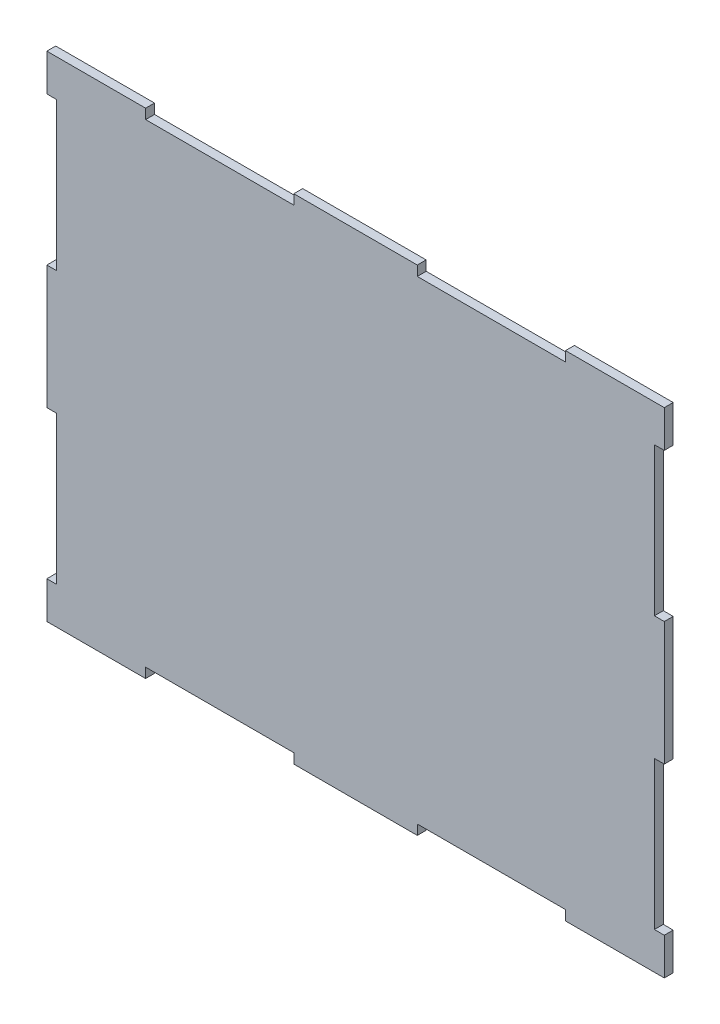
ISO-10303-21;
HEADER;
FILE_DESCRIPTION(('STEP AP214'),'2;1');
FILE_NAME('part.step','',(''),(''),'','','');
FILE_SCHEMA(('AUTOMOTIVE_DESIGN { 1 0 10303 214 1 1 1 1 }'));
ENDSEC;
DATA;
#1=APPLICATION_CONTEXT('core data for automotive mechanical design processes');
#2=APPLICATION_PROTOCOL_DEFINITION('international standard','automotive_design',2000,#1);
#3=PRODUCT_CONTEXT('',#1,'mechanical');
#4=PRODUCT('Part','Part','',(#3));
#5=PRODUCT_RELATED_PRODUCT_CATEGORY('part','',(#4));
#6=PRODUCT_DEFINITION_FORMATION('','',#4);
#7=PRODUCT_DEFINITION_CONTEXT('part definition',#1,'design');
#8=PRODUCT_DEFINITION('design','',#6,#7);
#9=PRODUCT_DEFINITION_SHAPE('','',#8);
#10=(LENGTH_UNIT() NAMED_UNIT(*) SI_UNIT(.MILLI.,.METRE.));
#11=(NAMED_UNIT(*) PLANE_ANGLE_UNIT() SI_UNIT($,.RADIAN.));
#12=(NAMED_UNIT(*) SI_UNIT($,.STERADIAN.) SOLID_ANGLE_UNIT());
#13=UNCERTAINTY_MEASURE_WITH_UNIT(LENGTH_MEASURE(1.E-05),#10,'distance_accuracy_value','');
#14=(GEOMETRIC_REPRESENTATION_CONTEXT(3) GLOBAL_UNCERTAINTY_ASSIGNED_CONTEXT((#13)) GLOBAL_UNIT_ASSIGNED_CONTEXT((#10,
#11,#12)) REPRESENTATION_CONTEXT('',''));
#15=CARTESIAN_POINT('',(0.,0.,0.));
#16=DIRECTION('',(0.,0.,1.));
#17=DIRECTION('',(1.,0.,0.));
#18=AXIS2_PLACEMENT_3D('',#15,#16,#17);
#19=CARTESIAN_POINT('',(-125.,-100.,3.6));
#20=DIRECTION('',(0.,1.,0.));
#21=DIRECTION('',(0.,0.,1.));
#22=AXIS2_PLACEMENT_3D('',#19,#20,#21);
#23=PLANE('',#22);
#24=DIRECTION('',(1.,0.,0.));
#25=VECTOR('',#24,1.);
#26=CARTESIAN_POINT('',(-125.,-100.,0.));
#27=LINE('',#26,#25);
#28=CARTESIAN_POINT('',(-25.,-100.,0.));
#29=VERTEX_POINT('',#28);
#30=CARTESIAN_POINT('',(25.,-100.,0.));
#31=VERTEX_POINT('',#30);
#32=EDGE_CURVE('E443',#29,#31,#27,.T.);
#33=ORIENTED_EDGE('',*,*,#32,.T.);
#34=DIRECTION('',(0.,0.,1.));
#35=VECTOR('',#34,1.);
#36=CARTESIAN_POINT('',(25.,-100.,-6.4));
#37=LINE('',#36,#35);
#38=CARTESIAN_POINT('',(25.,-100.,3.6));
#39=VERTEX_POINT('',#38);
#40=EDGE_CURVE('E284',#31,#39,#37,.T.);
#41=ORIENTED_EDGE('',*,*,#40,.T.);
#42=DIRECTION('',(1.,0.,0.));
#43=VECTOR('',#42,1.);
#44=CARTESIAN_POINT('',(-125.,-100.,3.6));
#45=LINE('',#44,#43);
#46=CARTESIAN_POINT('',(-25.,-100.,3.6));
#47=VERTEX_POINT('',#46);
#48=EDGE_CURVE('E423',#47,#39,#45,.T.);
#49=ORIENTED_EDGE('',*,*,#48,.F.);
#50=DIRECTION('',(0.,0.,1.));
#51=VECTOR('',#50,1.);
#52=CARTESIAN_POINT('',(-25.,-100.,-6.4));
#53=LINE('',#52,#51);
#54=EDGE_CURVE('E280',#29,#47,#53,.T.);
#55=ORIENTED_EDGE('',*,*,#54,.F.);
#56=EDGE_LOOP('',(#33,#41,#49,#55));
#57=FACE_BOUND('',#56,.T.);
#58=ADVANCED_FACE('F33',(#57),#23,.F.);
#59=CARTESIAN_POINT('',(85.,-100.,3.6));
#60=VERTEX_POINT('',#59);
#61=CARTESIAN_POINT('',(125.,-100.,3.6));
#62=VERTEX_POINT('',#61);
#63=EDGE_CURVE('E417',#60,#62,#45,.T.);
#64=ORIENTED_EDGE('',*,*,#63,.F.);
#65=DIRECTION('',(0.,0.,1.));
#66=VECTOR('',#65,1.);
#67=CARTESIAN_POINT('',(85.,-100.,-6.4));
#68=LINE('',#67,#66);
#69=CARTESIAN_POINT('',(85.,-100.,0.));
#70=VERTEX_POINT('',#69);
#71=EDGE_CURVE('E306',#70,#60,#68,.T.);
#72=ORIENTED_EDGE('',*,*,#71,.F.);
#73=CARTESIAN_POINT('',(125.,-100.,0.));
#74=VERTEX_POINT('',#73);
#75=EDGE_CURVE('E437',#70,#74,#27,.T.);
#76=ORIENTED_EDGE('',*,*,#75,.T.);
#77=DIRECTION('',(0.,0.,-1.));
#78=VECTOR('',#77,1.);
#79=CARTESIAN_POINT('',(125.,-100.,3.6));
#80=LINE('',#79,#78);
#81=EDGE_CURVE('E458',#62,#74,#80,.T.);
#82=ORIENTED_EDGE('',*,*,#81,.F.);
#83=EDGE_LOOP('',(#64,#72,#76,#82));
#84=FACE_BOUND('',#83,.T.);
#85=ADVANCED_FACE('F599',(#84),#23,.F.);
#86=CARTESIAN_POINT('',(-125.,100.,3.6));
#87=DIRECTION('',(0.,-1.,0.));
#88=DIRECTION('',(0.,0.,-1.));
#89=AXIS2_PLACEMENT_3D('',#86,#87,#88);
#90=PLANE('',#89);
#91=DIRECTION('',(-1.,0.,0.));
#92=VECTOR('',#91,1.);
#93=CARTESIAN_POINT('',(-125.,100.,3.6));
#94=LINE('',#93,#92);
#95=CARTESIAN_POINT('',(-85.,100.,3.6));
#96=VERTEX_POINT('',#95);
#97=CARTESIAN_POINT('',(-125.,100.,3.6));
#98=VERTEX_POINT('',#97);
#99=EDGE_CURVE('E427',#96,#98,#94,.T.);
#100=ORIENTED_EDGE('',*,*,#99,.F.);
#101=DIRECTION('',(0.,0.,1.));
#102=VECTOR('',#101,1.);
#103=CARTESIAN_POINT('',(-85.,100.,-6.4));
#104=LINE('',#103,#102);
#105=CARTESIAN_POINT('',(-85.,100.,0.));
#106=VERTEX_POINT('',#105);
#107=EDGE_CURVE('E323',#106,#96,#104,.T.);
#108=ORIENTED_EDGE('',*,*,#107,.F.);
#109=DIRECTION('',(-1.,0.,0.));
#110=VECTOR('',#109,1.);
#111=CARTESIAN_POINT('',(-125.,100.,0.));
#112=LINE('',#111,#110);
#113=CARTESIAN_POINT('',(-125.,100.,0.));
#114=VERTEX_POINT('',#113);
#115=EDGE_CURVE('E447',#106,#114,#112,.T.);
#116=ORIENTED_EDGE('',*,*,#115,.T.);
#117=DIRECTION('',(0.,0.,-1.));
#118=VECTOR('',#117,1.);
#119=CARTESIAN_POINT('',(-125.,100.,3.6));
#120=LINE('',#119,#118);
#121=EDGE_CURVE('E432',#98,#114,#120,.T.);
#122=ORIENTED_EDGE('',*,*,#121,.F.);
#123=EDGE_LOOP('',(#100,#108,#116,#122));
#124=FACE_BOUND('',#123,.T.);
#125=ADVANCED_FACE('F552',(#124),#90,.F.);
#126=CARTESIAN_POINT('',(25.,100.,0.));
#127=VERTEX_POINT('',#126);
#128=CARTESIAN_POINT('',(-25.,100.,0.));
#129=VERTEX_POINT('',#128);
#130=EDGE_CURVE('E452',#127,#129,#112,.T.);
#131=ORIENTED_EDGE('',*,*,#130,.T.);
#132=DIRECTION('',(0.,0.,1.));
#133=VECTOR('',#132,1.);
#134=CARTESIAN_POINT('',(-25.,100.,-6.4));
#135=LINE('',#134,#133);
#136=CARTESIAN_POINT('',(-25.,100.,3.6));
#137=VERTEX_POINT('',#136);
#138=EDGE_CURVE('E325',#129,#137,#135,.T.);
#139=ORIENTED_EDGE('',*,*,#138,.T.);
#140=CARTESIAN_POINT('',(25.,100.,3.6));
#141=VERTEX_POINT('',#140);
#142=EDGE_CURVE('E433',#141,#137,#94,.T.);
#143=ORIENTED_EDGE('',*,*,#142,.F.);
#144=DIRECTION('',(0.,0.,1.));
#145=VECTOR('',#144,1.);
#146=CARTESIAN_POINT('',(25.,100.,-6.4));
#147=LINE('',#146,#145);
#148=EDGE_CURVE('E340',#127,#141,#147,.T.);
#149=ORIENTED_EDGE('',*,*,#148,.F.);
#150=EDGE_LOOP('',(#131,#139,#143,#149));
#151=FACE_BOUND('',#150,.T.);
#152=ADVANCED_FACE('F548',(#151),#90,.F.);
#153=CARTESIAN_POINT('',(-125.,100.,3.6));
#154=DIRECTION('',(1.,0.,0.));
#155=DIRECTION('',(0.,1.,0.));
#156=AXIS2_PLACEMENT_3D('',#153,#154,#155);
#157=PLANE('',#156);
#158=DIRECTION('',(0.,-1.,0.));
#159=VECTOR('',#158,1.);
#160=CARTESIAN_POINT('',(-125.,100.,0.));
#161=LINE('',#160,#159);
#162=CARTESIAN_POINT('',(-125.,85.,0.));
#163=VERTEX_POINT('',#162);
#164=EDGE_CURVE('E434',#114,#163,#161,.T.);
#165=ORIENTED_EDGE('',*,*,#164,.T.);
#166=DIRECTION('',(0.,0.,1.));
#167=VECTOR('',#166,1.);
#168=CARTESIAN_POINT('',(-125.,85.,-6.4));
#169=LINE('',#168,#167);
#170=CARTESIAN_POINT('',(-125.,85.,3.6));
#171=VERTEX_POINT('',#170);
#172=EDGE_CURVE('E367',#163,#171,#169,.T.);
#173=ORIENTED_EDGE('',*,*,#172,.T.);
#174=DIRECTION('',(0.,-1.,0.));
#175=VECTOR('',#174,1.);
#176=CARTESIAN_POINT('',(-125.,100.,3.6));
#177=LINE('',#176,#175);
#178=EDGE_CURVE('E414',#98,#171,#177,.T.);
#179=ORIENTED_EDGE('',*,*,#178,.F.);
#180=ORIENTED_EDGE('',*,*,#121,.T.);
#181=EDGE_LOOP('',(#165,#173,#179,#180));
#182=FACE_BOUND('',#181,.T.);
#183=ADVANCED_FACE('F556',(#182),#157,.F.);
#184=CARTESIAN_POINT('',(-125.,-85.,3.6));
#185=VERTEX_POINT('',#184);
#186=CARTESIAN_POINT('',(-125.,-100.,3.6));
#187=VERTEX_POINT('',#186);
#188=EDGE_CURVE('E419',#185,#187,#177,.T.);
#189=ORIENTED_EDGE('',*,*,#188,.F.);
#190=DIRECTION('',(0.,0.,1.));
#191=VECTOR('',#190,1.);
#192=CARTESIAN_POINT('',(-125.,-85.,-6.4));
#193=LINE('',#192,#191);
#194=CARTESIAN_POINT('',(-125.,-85.,0.));
#195=VERTEX_POINT('',#194);
#196=EDGE_CURVE('E357',#195,#185,#193,.T.);
#197=ORIENTED_EDGE('',*,*,#196,.F.);
#198=CARTESIAN_POINT('',(-125.,-100.,0.));
#199=VERTEX_POINT('',#198);
#200=EDGE_CURVE('E408',#195,#199,#161,.T.);
#201=ORIENTED_EDGE('',*,*,#200,.T.);
#202=DIRECTION('',(0.,0.,-1.));
#203=VECTOR('',#202,1.);
#204=CARTESIAN_POINT('',(-125.,-100.,3.6));
#205=LINE('',#204,#203);
#206=EDGE_CURVE('E461',#187,#199,#205,.T.);
#207=ORIENTED_EDGE('',*,*,#206,.F.);
#208=EDGE_LOOP('',(#189,#197,#201,#207));
#209=FACE_BOUND('',#208,.T.);
#210=ADVANCED_FACE('F583',(#209),#157,.F.);
#211=CARTESIAN_POINT('',(125.,100.,3.6));
#212=DIRECTION('',(-1.,0.,0.));
#213=DIRECTION('',(0.,-1.,0.));
#214=AXIS2_PLACEMENT_3D('',#211,#212,#213);
#215=PLANE('',#214);
#216=DIRECTION('',(0.,1.,0.));
#217=VECTOR('',#216,1.);
#218=CARTESIAN_POINT('',(125.,100.,0.));
#219=LINE('',#218,#217);
#220=CARTESIAN_POINT('',(125.,-85.,0.));
#221=VERTEX_POINT('',#220);
#222=EDGE_CURVE('E444',#74,#221,#219,.T.);
#223=ORIENTED_EDGE('',*,*,#222,.T.);
#224=DIRECTION('',(0.,0.,1.));
#225=VECTOR('',#224,1.);
#226=CARTESIAN_POINT('',(125.,-85.,-6.4));
#227=LINE('',#226,#225);
#228=CARTESIAN_POINT('',(125.,-85.,3.6));
#229=VERTEX_POINT('',#228);
#230=EDGE_CURVE('E373',#221,#229,#227,.T.);
#231=ORIENTED_EDGE('',*,*,#230,.T.);
#232=DIRECTION('',(0.,1.,0.));
#233=VECTOR('',#232,1.);
#234=CARTESIAN_POINT('',(125.,100.,3.6));
#235=LINE('',#234,#233);
#236=EDGE_CURVE('E424',#62,#229,#235,.T.);
#237=ORIENTED_EDGE('',*,*,#236,.F.);
#238=ORIENTED_EDGE('',*,*,#81,.T.);
#239=EDGE_LOOP('',(#223,#231,#237,#238));
#240=FACE_BOUND('',#239,.T.);
#241=ADVANCED_FACE('F615',(#240),#215,.F.);
#242=CARTESIAN_POINT('',(125.,-25.,3.6));
#243=VERTEX_POINT('',#242);
#244=CARTESIAN_POINT('',(125.,25.,3.6));
#245=VERTEX_POINT('',#244);
#246=EDGE_CURVE('E428',#243,#245,#235,.T.);
#247=ORIENTED_EDGE('',*,*,#246,.F.);
#248=DIRECTION('',(0.,0.,1.));
#249=VECTOR('',#248,1.);
#250=CARTESIAN_POINT('',(125.,-25.,-6.4));
#251=LINE('',#250,#249);
#252=CARTESIAN_POINT('',(125.,-25.,0.));
#253=VERTEX_POINT('',#252);
#254=EDGE_CURVE('E372',#253,#243,#251,.T.);
#255=ORIENTED_EDGE('',*,*,#254,.F.);
#256=CARTESIAN_POINT('',(125.,25.,0.));
#257=VERTEX_POINT('',#256);
#258=EDGE_CURVE('E448',#253,#257,#219,.T.);
#259=ORIENTED_EDGE('',*,*,#258,.T.);
#260=DIRECTION('',(0.,0.,1.));
#261=VECTOR('',#260,1.);
#262=CARTESIAN_POINT('',(125.,25.,-6.4));
#263=LINE('',#262,#261);
#264=EDGE_CURVE('E405',#257,#245,#263,.T.);
#265=ORIENTED_EDGE('',*,*,#264,.T.);
#266=EDGE_LOOP('',(#247,#255,#259,#265));
#267=FACE_BOUND('',#266,.T.);
#268=ADVANCED_FACE('F616',(#267),#215,.F.);
#269=CARTESIAN_POINT('',(-125.,25.,3.6));
#270=VERTEX_POINT('',#269);
#271=CARTESIAN_POINT('',(-125.,-25.,3.6));
#272=VERTEX_POINT('',#271);
#273=EDGE_CURVE('E418',#270,#272,#177,.T.);
#274=ORIENTED_EDGE('',*,*,#273,.F.);
#275=DIRECTION('',(0.,0.,1.));
#276=VECTOR('',#275,1.);
#277=CARTESIAN_POINT('',(-125.,25.,-6.4));
#278=LINE('',#277,#276);
#279=CARTESIAN_POINT('',(-125.,25.,0.));
#280=VERTEX_POINT('',#279);
#281=EDGE_CURVE('E389',#280,#270,#278,.T.);
#282=ORIENTED_EDGE('',*,*,#281,.F.);
#283=CARTESIAN_POINT('',(-125.,-25.,0.));
#284=VERTEX_POINT('',#283);
#285=EDGE_CURVE('E438',#280,#284,#161,.T.);
#286=ORIENTED_EDGE('',*,*,#285,.T.);
#287=DIRECTION('',(0.,0.,1.));
#288=VECTOR('',#287,1.);
#289=CARTESIAN_POINT('',(-125.,-25.,-6.4));
#290=LINE('',#289,#288);
#291=EDGE_CURVE('E359',#284,#272,#290,.T.);
#292=ORIENTED_EDGE('',*,*,#291,.T.);
#293=EDGE_LOOP('',(#274,#282,#286,#292));
#294=FACE_BOUND('',#293,.T.);
#295=ADVANCED_FACE('F35',(#294),#157,.F.);
#296=CARTESIAN_POINT('',(-85.,-100.,0.));
#297=VERTEX_POINT('',#296);
#298=EDGE_CURVE('E439',#199,#297,#27,.T.);
#299=ORIENTED_EDGE('',*,*,#298,.T.);
#300=DIRECTION('',(0.,0.,1.));
#301=VECTOR('',#300,1.);
#302=CARTESIAN_POINT('',(-85.,-100.,-6.4));
#303=LINE('',#302,#301);
#304=CARTESIAN_POINT('',(-85.,-100.,3.6));
#305=VERTEX_POINT('',#304);
#306=EDGE_CURVE('E294',#297,#305,#303,.T.);
#307=ORIENTED_EDGE('',*,*,#306,.T.);
#308=EDGE_CURVE('E420',#187,#305,#45,.T.);
#309=ORIENTED_EDGE('',*,*,#308,.F.);
#310=ORIENTED_EDGE('',*,*,#206,.T.);
#311=EDGE_LOOP('',(#299,#307,#309,#310));
#312=FACE_BOUND('',#311,.T.);
#313=ADVANCED_FACE('F582',(#312),#23,.F.);
#314=CARTESIAN_POINT('',(125.,85.,3.6));
#315=VERTEX_POINT('',#314);
#316=CARTESIAN_POINT('',(125.,100.,3.6));
#317=VERTEX_POINT('',#316);
#318=EDGE_CURVE('E422',#315,#317,#235,.T.);
#319=ORIENTED_EDGE('',*,*,#318,.F.);
#320=DIRECTION('',(0.,0.,1.));
#321=VECTOR('',#320,1.);
#322=CARTESIAN_POINT('',(125.,85.,-6.4));
#323=LINE('',#322,#321);
#324=CARTESIAN_POINT('',(125.,85.,0.));
#325=VERTEX_POINT('',#324);
#326=EDGE_CURVE('E404',#325,#315,#323,.T.);
#327=ORIENTED_EDGE('',*,*,#326,.F.);
#328=CARTESIAN_POINT('',(125.,100.,0.));
#329=VERTEX_POINT('',#328);
#330=EDGE_CURVE('E442',#325,#329,#219,.T.);
#331=ORIENTED_EDGE('',*,*,#330,.T.);
#332=DIRECTION('',(0.,0.,-1.));
#333=VECTOR('',#332,1.);
#334=CARTESIAN_POINT('',(125.,100.,3.6));
#335=LINE('',#334,#333);
#336=EDGE_CURVE('E455',#317,#329,#335,.T.);
#337=ORIENTED_EDGE('',*,*,#336,.F.);
#338=EDGE_LOOP('',(#319,#327,#331,#337));
#339=FACE_BOUND('',#338,.T.);
#340=ADVANCED_FACE('F608',(#339),#215,.F.);
#341=CARTESIAN_POINT('',(85.,100.,0.));
#342=VERTEX_POINT('',#341);
#343=EDGE_CURVE('E449',#329,#342,#112,.T.);
#344=ORIENTED_EDGE('',*,*,#343,.T.);
#345=DIRECTION('',(0.,0.,1.));
#346=VECTOR('',#345,1.);
#347=CARTESIAN_POINT('',(85.,100.,-6.4));
#348=LINE('',#347,#346);
#349=CARTESIAN_POINT('',(85.,100.,3.6));
#350=VERTEX_POINT('',#349);
#351=EDGE_CURVE('E342',#342,#350,#348,.T.);
#352=ORIENTED_EDGE('',*,*,#351,.T.);
#353=EDGE_CURVE('E429',#317,#350,#94,.T.);
#354=ORIENTED_EDGE('',*,*,#353,.F.);
#355=ORIENTED_EDGE('',*,*,#336,.T.);
#356=EDGE_LOOP('',(#344,#352,#354,#355));
#357=FACE_BOUND('',#356,.T.);
#358=ADVANCED_FACE('F613',(#357),#90,.F.);
#359=CARTESIAN_POINT('',(0.,0.,3.6));
#360=DIRECTION('',(0.,0.,1.));
#361=DIRECTION('',(1.,0.,0.));
#362=AXIS2_PLACEMENT_3D('',#359,#360,#361);
#363=PLANE('',#362);
#364=DIRECTION('',(0.,-1.,0.));
#365=VECTOR('',#364,1.);
#366=CARTESIAN_POINT('',(-85.,96.,3.6));
#367=LINE('',#366,#365);
#368=CARTESIAN_POINT('',(-85.,96.,3.6));
#369=VERTEX_POINT('',#368);
#370=EDGE_CURVE('E318',#96,#369,#367,.T.);
#371=ORIENTED_EDGE('',*,*,#370,.F.);
#372=ORIENTED_EDGE('',*,*,#99,.T.);
#373=ORIENTED_EDGE('',*,*,#178,.T.);
#374=DIRECTION('',(-1.,0.,0.));
#375=VECTOR('',#374,1.);
#376=CARTESIAN_POINT('',(-125.,85.,3.6));
#377=LINE('',#376,#375);
#378=CARTESIAN_POINT('',(-121.,85.,3.6));
#379=VERTEX_POINT('',#378);
#380=EDGE_CURVE('E387',#379,#171,#377,.T.);
#381=ORIENTED_EDGE('',*,*,#380,.F.);
#382=DIRECTION('',(0.,1.,0.));
#383=VECTOR('',#382,1.);
#384=CARTESIAN_POINT('',(-121.,85.,3.6));
#385=LINE('',#384,#383);
#386=CARTESIAN_POINT('',(-121.,25.,3.6));
#387=VERTEX_POINT('',#386);
#388=EDGE_CURVE('E384',#387,#379,#385,.T.);
#389=ORIENTED_EDGE('',*,*,#388,.F.);
#390=DIRECTION('',(1.,0.,0.));
#391=VECTOR('',#390,1.);
#392=CARTESIAN_POINT('',(-125.,25.,3.6));
#393=LINE('',#392,#391);
#394=EDGE_CURVE('E356',#270,#387,#393,.T.);
#395=ORIENTED_EDGE('',*,*,#394,.F.);
#396=ORIENTED_EDGE('',*,*,#273,.T.);
#397=DIRECTION('',(-1.,0.,0.));
#398=VECTOR('',#397,1.);
#399=CARTESIAN_POINT('',(-125.,-25.,3.6));
#400=LINE('',#399,#398);
#401=CARTESIAN_POINT('',(-121.,-25.,3.6));
#402=VERTEX_POINT('',#401);
#403=EDGE_CURVE('E348',#402,#272,#400,.T.);
#404=ORIENTED_EDGE('',*,*,#403,.F.);
#405=DIRECTION('',(0.,1.,0.));
#406=VECTOR('',#405,1.);
#407=CARTESIAN_POINT('',(-121.,-25.,3.6));
#408=LINE('',#407,#406);
#409=CARTESIAN_POINT('',(-121.,-85.,3.6));
#410=VERTEX_POINT('',#409);
#411=EDGE_CURVE('E339',#410,#402,#408,.T.);
#412=ORIENTED_EDGE('',*,*,#411,.F.);
#413=DIRECTION('',(1.,0.,0.));
#414=VECTOR('',#413,1.);
#415=CARTESIAN_POINT('',(-125.,-85.,3.6));
#416=LINE('',#415,#414);
#417=EDGE_CURVE('E350',#185,#410,#416,.T.);
#418=ORIENTED_EDGE('',*,*,#417,.F.);
#419=ORIENTED_EDGE('',*,*,#188,.T.);
#420=ORIENTED_EDGE('',*,*,#308,.T.);
#421=DIRECTION('',(0.,-1.,0.));
#422=VECTOR('',#421,1.);
#423=CARTESIAN_POINT('',(-85.,-96.,3.6));
#424=LINE('',#423,#422);
#425=CARTESIAN_POINT('',(-85.,-96.,3.6));
#426=VERTEX_POINT('',#425);
#427=EDGE_CURVE('E274',#426,#305,#424,.T.);
#428=ORIENTED_EDGE('',*,*,#427,.F.);
#429=DIRECTION('',(-1.,0.,0.));
#430=VECTOR('',#429,1.);
#431=CARTESIAN_POINT('',(-85.,-96.,3.6));
#432=LINE('',#431,#430);
#433=CARTESIAN_POINT('',(-25.,-96.,3.6));
#434=VERTEX_POINT('',#433);
#435=EDGE_CURVE('E268',#434,#426,#432,.T.);
#436=ORIENTED_EDGE('',*,*,#435,.F.);
#437=DIRECTION('',(0.,1.,0.));
#438=VECTOR('',#437,1.);
#439=CARTESIAN_POINT('',(-25.,-96.,3.6));
#440=LINE('',#439,#438);
#441=EDGE_CURVE('E277',#47,#434,#440,.T.);
#442=ORIENTED_EDGE('',*,*,#441,.F.);
#443=ORIENTED_EDGE('',*,*,#48,.T.);
#444=DIRECTION('',(0.,-1.,0.));
#445=VECTOR('',#444,1.);
#446=CARTESIAN_POINT('',(25.,-96.,3.6));
#447=LINE('',#446,#445);
#448=CARTESIAN_POINT('',(25.,-96.,3.6));
#449=VERTEX_POINT('',#448);
#450=EDGE_CURVE('E304',#449,#39,#447,.T.);
#451=ORIENTED_EDGE('',*,*,#450,.F.);
#452=DIRECTION('',(-1.,0.,0.));
#453=VECTOR('',#452,1.);
#454=CARTESIAN_POINT('',(25.,-96.,3.6));
#455=LINE('',#454,#453);
#456=CARTESIAN_POINT('',(85.,-96.,3.6));
#457=VERTEX_POINT('',#456);
#458=EDGE_CURVE('E300',#457,#449,#455,.T.);
#459=ORIENTED_EDGE('',*,*,#458,.F.);
#460=DIRECTION('',(0.,1.,0.));
#461=VECTOR('',#460,1.);
#462=CARTESIAN_POINT('',(85.,-96.,3.6));
#463=LINE('',#462,#461);
#464=EDGE_CURVE('E298',#60,#457,#463,.T.);
#465=ORIENTED_EDGE('',*,*,#464,.F.);
#466=ORIENTED_EDGE('',*,*,#63,.T.);
#467=ORIENTED_EDGE('',*,*,#236,.T.);
#468=DIRECTION('',(1.,0.,0.));
#469=VECTOR('',#468,1.);
#470=CARTESIAN_POINT('',(125.,-85.,3.6));
#471=LINE('',#470,#469);
#472=CARTESIAN_POINT('',(121.,-85.,3.6));
#473=VERTEX_POINT('',#472);
#474=EDGE_CURVE('E370',#473,#229,#471,.T.);
#475=ORIENTED_EDGE('',*,*,#474,.F.);
#476=DIRECTION('',(0.,-1.,0.));
#477=VECTOR('',#476,1.);
#478=CARTESIAN_POINT('',(121.,-25.,3.6));
#479=LINE('',#478,#477);
#480=CARTESIAN_POINT('',(121.,-25.,3.6));
#481=VERTEX_POINT('',#480);
#482=EDGE_CURVE('E366',#481,#473,#479,.T.);
#483=ORIENTED_EDGE('',*,*,#482,.F.);
#484=DIRECTION('',(-1.,0.,0.));
#485=VECTOR('',#484,1.);
#486=CARTESIAN_POINT('',(125.,-25.,3.6));
#487=LINE('',#486,#485);
#488=EDGE_CURVE('E363',#243,#481,#487,.T.);
#489=ORIENTED_EDGE('',*,*,#488,.F.);
#490=ORIENTED_EDGE('',*,*,#246,.T.);
#491=DIRECTION('',(1.,0.,0.));
#492=VECTOR('',#491,1.);
#493=CARTESIAN_POINT('',(125.,25.,3.6));
#494=LINE('',#493,#492);
#495=CARTESIAN_POINT('',(121.,25.,3.6));
#496=VERTEX_POINT('',#495);
#497=EDGE_CURVE('E402',#496,#245,#494,.T.);
#498=ORIENTED_EDGE('',*,*,#497,.F.);
#499=DIRECTION('',(0.,-1.,0.));
#500=VECTOR('',#499,1.);
#501=CARTESIAN_POINT('',(121.,85.,3.6));
#502=LINE('',#501,#500);
#503=CARTESIAN_POINT('',(121.,85.,3.6));
#504=VERTEX_POINT('',#503);
#505=EDGE_CURVE('E399',#504,#496,#502,.T.);
#506=ORIENTED_EDGE('',*,*,#505,.F.);
#507=DIRECTION('',(-1.,0.,0.));
#508=VECTOR('',#507,1.);
#509=CARTESIAN_POINT('',(125.,85.,3.6));
#510=LINE('',#509,#508);
#511=EDGE_CURVE('E376',#315,#504,#510,.T.);
#512=ORIENTED_EDGE('',*,*,#511,.F.);
#513=ORIENTED_EDGE('',*,*,#318,.T.);
#514=ORIENTED_EDGE('',*,*,#353,.T.);
#515=DIRECTION('',(0.,1.,0.));
#516=VECTOR('',#515,1.);
#517=CARTESIAN_POINT('',(85.,96.,3.6));
#518=LINE('',#517,#516);
#519=CARTESIAN_POINT('',(85.,96.,3.6));
#520=VERTEX_POINT('',#519);
#521=EDGE_CURVE('E331',#520,#350,#518,.T.);
#522=ORIENTED_EDGE('',*,*,#521,.F.);
#523=DIRECTION('',(1.,0.,0.));
#524=VECTOR('',#523,1.);
#525=CARTESIAN_POINT('',(25.,96.,3.6));
#526=LINE('',#525,#524);
#527=CARTESIAN_POINT('',(25.,96.,3.6));
#528=VERTEX_POINT('',#527);
#529=EDGE_CURVE('E293',#528,#520,#526,.T.);
#530=ORIENTED_EDGE('',*,*,#529,.F.);
#531=DIRECTION('',(0.,-1.,0.));
#532=VECTOR('',#531,1.);
#533=CARTESIAN_POINT('',(25.,96.,3.6));
#534=LINE('',#533,#532);
#535=EDGE_CURVE('E333',#141,#528,#534,.T.);
#536=ORIENTED_EDGE('',*,*,#535,.F.);
#537=ORIENTED_EDGE('',*,*,#142,.T.);
#538=DIRECTION('',(0.,1.,0.));
#539=VECTOR('',#538,1.);
#540=CARTESIAN_POINT('',(-25.,96.,3.6));
#541=LINE('',#540,#539);
#542=CARTESIAN_POINT('',(-25.,96.,3.6));
#543=VERTEX_POINT('',#542);
#544=EDGE_CURVE('E316',#543,#137,#541,.T.);
#545=ORIENTED_EDGE('',*,*,#544,.F.);
#546=DIRECTION('',(1.,0.,0.));
#547=VECTOR('',#546,1.);
#548=CARTESIAN_POINT('',(-85.,96.,3.6));
#549=LINE('',#548,#547);
#550=EDGE_CURVE('E313',#369,#543,#549,.T.);
#551=ORIENTED_EDGE('',*,*,#550,.F.);
#552=EDGE_LOOP('',(#371,#372,#373,#381,#389,#395,#396,#404,#412,#418,#419,#420,#428,#436,#442,
#443,#451,#459,#465,#466,#467,#475,#483,#489,#490,#498,#506,#512,#513,#514,#522,#530,#536,#537,
#545,#551));
#553=FACE_BOUND('',#552,.T.);
#554=ADVANCED_FACE('F287',(#553),#363,.T.);
#555=CARTESIAN_POINT('',(0.,0.,0.));
#556=DIRECTION('',(0.,0.,1.));
#557=DIRECTION('',(1.,0.,0.));
#558=AXIS2_PLACEMENT_3D('',#555,#556,#557);
#559=PLANE('',#558);
#560=ORIENTED_EDGE('',*,*,#115,.F.);
#561=DIRECTION('',(0.,-1.,0.));
#562=VECTOR('',#561,1.);
#563=CARTESIAN_POINT('',(-85.,0.,0.));
#564=LINE('',#563,#562);
#565=CARTESIAN_POINT('',(-85.,96.,0.));
#566=VERTEX_POINT('',#565);
#567=EDGE_CURVE('E11',#106,#566,#564,.T.);
#568=ORIENTED_EDGE('',*,*,#567,.T.);
#569=DIRECTION('',(1.,0.,0.));
#570=VECTOR('',#569,1.);
#571=CARTESIAN_POINT('',(0.,96.,0.));
#572=LINE('',#571,#570);
#573=CARTESIAN_POINT('',(-25.,96.,0.));
#574=VERTEX_POINT('',#573);
#575=EDGE_CURVE('E41',#566,#574,#572,.T.);
#576=ORIENTED_EDGE('',*,*,#575,.T.);
#577=DIRECTION('',(0.,1.,0.));
#578=VECTOR('',#577,1.);
#579=CARTESIAN_POINT('',(-25.,0.,0.));
#580=LINE('',#579,#578);
#581=EDGE_CURVE('E524',#574,#129,#580,.T.);
#582=ORIENTED_EDGE('',*,*,#581,.T.);
#583=ORIENTED_EDGE('',*,*,#130,.F.);
#584=DIRECTION('',(0.,-1.,0.));
#585=VECTOR('',#584,1.);
#586=CARTESIAN_POINT('',(25.0000000000001,0.,0.));
#587=LINE('',#586,#585);
#588=CARTESIAN_POINT('',(25.,96.,0.));
#589=VERTEX_POINT('',#588);
#590=EDGE_CURVE('E506',#127,#589,#587,.T.);
#591=ORIENTED_EDGE('',*,*,#590,.T.);
#592=DIRECTION('',(1.,0.,0.));
#593=VECTOR('',#592,1.);
#594=CARTESIAN_POINT('',(0.,96.,0.));
#595=LINE('',#594,#593);
#596=CARTESIAN_POINT('',(85.,96.,0.));
#597=VERTEX_POINT('',#596);
#598=EDGE_CURVE('E503',#589,#597,#595,.T.);
#599=ORIENTED_EDGE('',*,*,#598,.T.);
#600=DIRECTION('',(0.,1.,0.));
#601=VECTOR('',#600,1.);
#602=CARTESIAN_POINT('',(85.,0.,0.));
#603=LINE('',#602,#601);
#604=EDGE_CURVE('E500',#597,#342,#603,.T.);
#605=ORIENTED_EDGE('',*,*,#604,.T.);
#606=ORIENTED_EDGE('',*,*,#343,.F.);
#607=ORIENTED_EDGE('',*,*,#330,.F.);
#608=DIRECTION('',(-1.,0.,0.));
#609=VECTOR('',#608,1.);
#610=CARTESIAN_POINT('',(5.89805981832128E-13,85.0000000000009,0.));
#611=LINE('',#610,#609);
#612=CARTESIAN_POINT('',(121.,85.,0.));
#613=VERTEX_POINT('',#612);
#614=EDGE_CURVE('E464',#325,#613,#611,.T.);
#615=ORIENTED_EDGE('',*,*,#614,.T.);
#616=DIRECTION('',(0.,-1.,0.));
#617=VECTOR('',#616,1.);
#618=CARTESIAN_POINT('',(121.,0.,0.));
#619=LINE('',#618,#617);
#620=CARTESIAN_POINT('',(121.,25.,0.));
#621=VERTEX_POINT('',#620);
#622=EDGE_CURVE('E467',#613,#621,#619,.T.);
#623=ORIENTED_EDGE('',*,*,#622,.T.);
#624=DIRECTION('',(1.,0.,0.));
#625=VECTOR('',#624,1.);
#626=CARTESIAN_POINT('',(1.951563910474E-13,25.000000000001,0.));
#627=LINE('',#626,#625);
#628=EDGE_CURVE('E470',#621,#257,#627,.T.);
#629=ORIENTED_EDGE('',*,*,#628,.T.);
#630=ORIENTED_EDGE('',*,*,#258,.F.);
#631=DIRECTION('',(-1.,0.,0.));
#632=VECTOR('',#631,1.);
#633=CARTESIAN_POINT('',(-1.95156391047386E-13,-24.999999999999,0.));
#634=LINE('',#633,#632);
#635=CARTESIAN_POINT('',(121.,-25.,0.));
#636=VERTEX_POINT('',#635);
#637=EDGE_CURVE('E491',#253,#636,#634,.T.);
#638=ORIENTED_EDGE('',*,*,#637,.T.);
#639=DIRECTION('',(0.,-1.,0.));
#640=VECTOR('',#639,1.);
#641=CARTESIAN_POINT('',(121.,0.,0.));
#642=LINE('',#641,#640);
#643=CARTESIAN_POINT('',(121.,-85.,0.));
#644=VERTEX_POINT('',#643);
#645=EDGE_CURVE('E494',#636,#644,#642,.T.);
#646=ORIENTED_EDGE('',*,*,#645,.T.);
#647=DIRECTION('',(1.,0.,0.));
#648=VECTOR('',#647,1.);
#649=CARTESIAN_POINT('',(-5.89805981832116E-13,-84.9999999999991,0.));
#650=LINE('',#649,#648);
#651=EDGE_CURVE('E497',#644,#221,#650,.T.);
#652=ORIENTED_EDGE('',*,*,#651,.T.);
#653=ORIENTED_EDGE('',*,*,#222,.F.);
#654=ORIENTED_EDGE('',*,*,#75,.F.);
#655=DIRECTION('',(0.,1.,0.));
#656=VECTOR('',#655,1.);
#657=CARTESIAN_POINT('',(85.,0.,0.));
#658=LINE('',#657,#656);
#659=CARTESIAN_POINT('',(85.,-96.,0.));
#660=VERTEX_POINT('',#659);
#661=EDGE_CURVE('E515',#70,#660,#658,.T.);
#662=ORIENTED_EDGE('',*,*,#661,.T.);
#663=DIRECTION('',(-1.,0.,0.));
#664=VECTOR('',#663,1.);
#665=CARTESIAN_POINT('',(0.,-96.,0.));
#666=LINE('',#665,#664);
#667=CARTESIAN_POINT('',(25.,-96.,0.));
#668=VERTEX_POINT('',#667);
#669=EDGE_CURVE('E518',#660,#668,#666,.T.);
#670=ORIENTED_EDGE('',*,*,#669,.T.);
#671=DIRECTION('',(0.,-1.,0.));
#672=VECTOR('',#671,1.);
#673=CARTESIAN_POINT('',(25.0000000000001,0.,0.));
#674=LINE('',#673,#672);
#675=EDGE_CURVE('E521',#668,#31,#674,.T.);
#676=ORIENTED_EDGE('',*,*,#675,.T.);
#677=ORIENTED_EDGE('',*,*,#32,.F.);
#678=DIRECTION('',(0.,1.,0.));
#679=VECTOR('',#678,1.);
#680=CARTESIAN_POINT('',(-25.,0.,0.));
#681=LINE('',#680,#679);
#682=CARTESIAN_POINT('',(-25.,-96.,0.));
#683=VERTEX_POINT('',#682);
#684=EDGE_CURVE('E513',#29,#683,#681,.T.);
#685=ORIENTED_EDGE('',*,*,#684,.T.);
#686=DIRECTION('',(-1.,0.,0.));
#687=VECTOR('',#686,1.);
#688=CARTESIAN_POINT('',(0.,-96.,0.));
#689=LINE('',#688,#687);
#690=CARTESIAN_POINT('',(-85.,-96.,0.));
#691=VERTEX_POINT('',#690);
#692=EDGE_CURVE('E271',#683,#691,#689,.T.);
#693=ORIENTED_EDGE('',*,*,#692,.T.);
#694=DIRECTION('',(0.,-1.,0.));
#695=VECTOR('',#694,1.);
#696=CARTESIAN_POINT('',(-85.,0.,0.));
#697=LINE('',#696,#695);
#698=EDGE_CURVE('E510',#691,#297,#697,.T.);
#699=ORIENTED_EDGE('',*,*,#698,.T.);
#700=ORIENTED_EDGE('',*,*,#298,.F.);
#701=ORIENTED_EDGE('',*,*,#200,.F.);
#702=DIRECTION('',(1.,0.,0.));
#703=VECTOR('',#702,1.);
#704=CARTESIAN_POINT('',(0.,-85.,0.));
#705=LINE('',#704,#703);
#706=CARTESIAN_POINT('',(-121.,-85.,0.));
#707=VERTEX_POINT('',#706);
#708=EDGE_CURVE('E479',#195,#707,#705,.T.);
#709=ORIENTED_EDGE('',*,*,#708,.T.);
#710=DIRECTION('',(0.,1.,0.));
#711=VECTOR('',#710,1.);
#712=CARTESIAN_POINT('',(-121.,0.,0.));
#713=LINE('',#712,#711);
#714=CARTESIAN_POINT('',(-121.,-25.,0.));
#715=VERTEX_POINT('',#714);
#716=EDGE_CURVE('E476',#707,#715,#713,.T.);
#717=ORIENTED_EDGE('',*,*,#716,.T.);
#718=DIRECTION('',(-1.,0.,0.));
#719=VECTOR('',#718,1.);
#720=CARTESIAN_POINT('',(0.,-25.,0.));
#721=LINE('',#720,#719);
#722=EDGE_CURVE('E473',#715,#284,#721,.T.);
#723=ORIENTED_EDGE('',*,*,#722,.T.);
#724=ORIENTED_EDGE('',*,*,#285,.F.);
#725=DIRECTION('',(1.,0.,0.));
#726=VECTOR('',#725,1.);
#727=CARTESIAN_POINT('',(0.,25.,0.));
#728=LINE('',#727,#726);
#729=CARTESIAN_POINT('',(-121.,25.,0.));
#730=VERTEX_POINT('',#729);
#731=EDGE_CURVE('E482',#280,#730,#728,.T.);
#732=ORIENTED_EDGE('',*,*,#731,.T.);
#733=DIRECTION('',(0.,1.,0.));
#734=VECTOR('',#733,1.);
#735=CARTESIAN_POINT('',(-121.,0.,0.));
#736=LINE('',#735,#734);
#737=CARTESIAN_POINT('',(-121.,85.,0.));
#738=VERTEX_POINT('',#737);
#739=EDGE_CURVE('E485',#730,#738,#736,.T.);
#740=ORIENTED_EDGE('',*,*,#739,.T.);
#741=DIRECTION('',(-1.,0.,0.));
#742=VECTOR('',#741,1.);
#743=CARTESIAN_POINT('',(0.,85.,0.));
#744=LINE('',#743,#742);
#745=EDGE_CURVE('E488',#738,#163,#744,.T.);
#746=ORIENTED_EDGE('',*,*,#745,.T.);
#747=ORIENTED_EDGE('',*,*,#164,.F.);
#748=EDGE_LOOP('',(#560,#568,#576,#582,#583,#591,#599,#605,#606,#607,#615,#623,#629,#630,#638,
#646,#652,#653,#654,#662,#670,#676,#677,#685,#693,#699,#700,#701,#709,#717,#723,#724,#732,#740,
#746,#747));
#749=FACE_BOUND('',#748,.T.);
#750=ADVANCED_FACE('F529',(#749),#559,.F.);
#751=CARTESIAN_POINT('',(125.,25.,-6.4));
#752=DIRECTION('',(0.,-1.,0.));
#753=DIRECTION('',(1.,0.,0.));
#754=AXIS2_PLACEMENT_3D('',#751,#752,#753);
#755=PLANE('',#754);
#756=DIRECTION('',(0.,0.,1.));
#757=VECTOR('',#756,1.);
#758=CARTESIAN_POINT('',(121.,25.,-6.4));
#759=LINE('',#758,#757);
#760=EDGE_CURVE('E409',#621,#496,#759,.T.);
#761=ORIENTED_EDGE('',*,*,#760,.T.);
#762=ORIENTED_EDGE('',*,*,#497,.T.);
#763=ORIENTED_EDGE('',*,*,#264,.F.);
#764=ORIENTED_EDGE('',*,*,#628,.F.);
#765=EDGE_LOOP('',(#761,#762,#763,#764));
#766=FACE_BOUND('',#765,.T.);
#767=ADVANCED_FACE('F635',(#766),#755,.F.);
#768=CARTESIAN_POINT('',(121.,85.,-6.4));
#769=DIRECTION('',(-1.,0.,0.));
#770=DIRECTION('',(0.,0.,1.));
#771=AXIS2_PLACEMENT_3D('',#768,#769,#770);
#772=PLANE('',#771);
#773=DIRECTION('',(0.,0.,1.));
#774=VECTOR('',#773,1.);
#775=CARTESIAN_POINT('',(121.,85.,-6.4));
#776=LINE('',#775,#774);
#777=EDGE_CURVE('E411',#613,#504,#776,.T.);
#778=ORIENTED_EDGE('',*,*,#777,.T.);
#779=ORIENTED_EDGE('',*,*,#505,.T.);
#780=ORIENTED_EDGE('',*,*,#760,.F.);
#781=ORIENTED_EDGE('',*,*,#622,.F.);
#782=EDGE_LOOP('',(#778,#779,#780,#781));
#783=FACE_BOUND('',#782,.T.);
#784=ADVANCED_FACE('F642',(#783),#772,.F.);
#785=CARTESIAN_POINT('',(125.,85.,-6.4));
#786=DIRECTION('',(0.,1.,0.));
#787=DIRECTION('',(-1.,0.,0.));
#788=AXIS2_PLACEMENT_3D('',#785,#786,#787);
#789=PLANE('',#788);
#790=ORIENTED_EDGE('',*,*,#326,.T.);
#791=ORIENTED_EDGE('',*,*,#511,.T.);
#792=ORIENTED_EDGE('',*,*,#777,.F.);
#793=ORIENTED_EDGE('',*,*,#614,.F.);
#794=EDGE_LOOP('',(#790,#791,#792,#793));
#795=FACE_BOUND('',#794,.T.);
#796=ADVANCED_FACE('F638',(#795),#789,.F.);
#797=CARTESIAN_POINT('',(-121.,-25.,-6.4));
#798=DIRECTION('',(1.,0.,0.));
#799=DIRECTION('',(0.,1.,0.));
#800=AXIS2_PLACEMENT_3D('',#797,#798,#799);
#801=PLANE('',#800);
#802=DIRECTION('',(0.,0.,1.));
#803=VECTOR('',#802,1.);
#804=CARTESIAN_POINT('',(-121.,-85.,-6.4));
#805=LINE('',#804,#803);
#806=EDGE_CURVE('E354',#707,#410,#805,.T.);
#807=ORIENTED_EDGE('',*,*,#806,.T.);
#808=ORIENTED_EDGE('',*,*,#411,.T.);
#809=DIRECTION('',(0.,0.,1.));
#810=VECTOR('',#809,1.);
#811=CARTESIAN_POINT('',(-121.,-25.,-6.4));
#812=LINE('',#811,#810);
#813=EDGE_CURVE('E353',#715,#402,#812,.T.);
#814=ORIENTED_EDGE('',*,*,#813,.F.);
#815=ORIENTED_EDGE('',*,*,#716,.F.);
#816=EDGE_LOOP('',(#807,#808,#814,#815));
#817=FACE_BOUND('',#816,.T.);
#818=ADVANCED_FACE('F641',(#817),#801,.F.);
#819=CARTESIAN_POINT('',(-125.,-85.,-6.4));
#820=DIRECTION('',(0.,-1.,0.));
#821=DIRECTION('',(0.,0.,-1.));
#822=AXIS2_PLACEMENT_3D('',#819,#820,#821);
#823=PLANE('',#822);
#824=ORIENTED_EDGE('',*,*,#196,.T.);
#825=ORIENTED_EDGE('',*,*,#417,.T.);
#826=ORIENTED_EDGE('',*,*,#806,.F.);
#827=ORIENTED_EDGE('',*,*,#708,.F.);
#828=EDGE_LOOP('',(#824,#825,#826,#827));
#829=FACE_BOUND('',#828,.T.);
#830=ADVANCED_FACE('F673',(#829),#823,.F.);
#831=CARTESIAN_POINT('',(-125.,-25.,-6.4));
#832=DIRECTION('',(0.,1.,0.));
#833=DIRECTION('',(0.,0.,1.));
#834=AXIS2_PLACEMENT_3D('',#831,#832,#833);
#835=PLANE('',#834);
#836=ORIENTED_EDGE('',*,*,#813,.T.);
#837=ORIENTED_EDGE('',*,*,#403,.T.);
#838=ORIENTED_EDGE('',*,*,#291,.F.);
#839=ORIENTED_EDGE('',*,*,#722,.F.);
#840=EDGE_LOOP('',(#836,#837,#838,#839));
#841=FACE_BOUND('',#840,.T.);
#842=ADVANCED_FACE('F658',(#841),#835,.F.);
#843=CARTESIAN_POINT('',(-125.,85.,-6.4));
#844=DIRECTION('',(0.,1.,0.));
#845=DIRECTION('',(0.,0.,1.));
#846=AXIS2_PLACEMENT_3D('',#843,#844,#845);
#847=PLANE('',#846);
#848=DIRECTION('',(0.,0.,1.));
#849=VECTOR('',#848,1.);
#850=CARTESIAN_POINT('',(-121.,85.,-6.4));
#851=LINE('',#850,#849);
#852=EDGE_CURVE('E392',#738,#379,#851,.T.);
#853=ORIENTED_EDGE('',*,*,#852,.T.);
#854=ORIENTED_EDGE('',*,*,#380,.T.);
#855=ORIENTED_EDGE('',*,*,#172,.F.);
#856=ORIENTED_EDGE('',*,*,#745,.F.);
#857=EDGE_LOOP('',(#853,#854,#855,#856));
#858=FACE_BOUND('',#857,.T.);
#859=ADVANCED_FACE('F560',(#858),#847,.F.);
#860=CARTESIAN_POINT('',(-121.,85.,-6.4));
#861=DIRECTION('',(1.,0.,0.));
#862=DIRECTION('',(0.,0.,-1.));
#863=AXIS2_PLACEMENT_3D('',#860,#861,#862);
#864=PLANE('',#863);
#865=DIRECTION('',(0.,0.,1.));
#866=VECTOR('',#865,1.);
#867=CARTESIAN_POINT('',(-121.,25.,-6.4));
#868=LINE('',#867,#866);
#869=EDGE_CURVE('E394',#730,#387,#868,.T.);
#870=ORIENTED_EDGE('',*,*,#869,.T.);
#871=ORIENTED_EDGE('',*,*,#388,.T.);
#872=ORIENTED_EDGE('',*,*,#852,.F.);
#873=ORIENTED_EDGE('',*,*,#739,.F.);
#874=EDGE_LOOP('',(#870,#871,#872,#873));
#875=FACE_BOUND('',#874,.T.);
#876=ADVANCED_FACE('F562',(#875),#864,.F.);
#877=CARTESIAN_POINT('',(-125.,25.,-6.4));
#878=DIRECTION('',(0.,-1.,0.));
#879=DIRECTION('',(0.,0.,-1.));
#880=AXIS2_PLACEMENT_3D('',#877,#878,#879);
#881=PLANE('',#880);
#882=ORIENTED_EDGE('',*,*,#281,.T.);
#883=ORIENTED_EDGE('',*,*,#394,.T.);
#884=ORIENTED_EDGE('',*,*,#869,.F.);
#885=ORIENTED_EDGE('',*,*,#731,.F.);
#886=EDGE_LOOP('',(#882,#883,#884,#885));
#887=FACE_BOUND('',#886,.T.);
#888=ADVANCED_FACE('F650',(#887),#881,.F.);
#889=CARTESIAN_POINT('',(125.,-85.,-6.4));
#890=DIRECTION('',(0.,-1.,0.));
#891=DIRECTION('',(1.,0.,0.));
#892=AXIS2_PLACEMENT_3D('',#889,#890,#891);
#893=PLANE('',#892);
#894=DIRECTION('',(0.,0.,1.));
#895=VECTOR('',#894,1.);
#896=CARTESIAN_POINT('',(121.,-85.,-6.4));
#897=LINE('',#896,#895);
#898=EDGE_CURVE('E377',#644,#473,#897,.T.);
#899=ORIENTED_EDGE('',*,*,#898,.T.);
#900=ORIENTED_EDGE('',*,*,#474,.T.);
#901=ORIENTED_EDGE('',*,*,#230,.F.);
#902=ORIENTED_EDGE('',*,*,#651,.F.);
#903=EDGE_LOOP('',(#899,#900,#901,#902));
#904=FACE_BOUND('',#903,.T.);
#905=ADVANCED_FACE('F653',(#904),#893,.F.);
#906=CARTESIAN_POINT('',(121.,-25.,-6.4));
#907=DIRECTION('',(-1.,0.,0.));
#908=DIRECTION('',(0.,-1.,0.));
#909=AXIS2_PLACEMENT_3D('',#906,#907,#908);
#910=PLANE('',#909);
#911=DIRECTION('',(0.,0.,1.));
#912=VECTOR('',#911,1.);
#913=CARTESIAN_POINT('',(121.,-25.,-6.4));
#914=LINE('',#913,#912);
#915=EDGE_CURVE('E379',#636,#481,#914,.T.);
#916=ORIENTED_EDGE('',*,*,#915,.T.);
#917=ORIENTED_EDGE('',*,*,#482,.T.);
#918=ORIENTED_EDGE('',*,*,#898,.F.);
#919=ORIENTED_EDGE('',*,*,#645,.F.);
#920=EDGE_LOOP('',(#916,#917,#918,#919));
#921=FACE_BOUND('',#920,.T.);
#922=ADVANCED_FACE('F663',(#921),#910,.F.);
#923=CARTESIAN_POINT('',(125.,-25.,-6.4));
#924=DIRECTION('',(0.,1.,0.));
#925=DIRECTION('',(-1.,0.,0.));
#926=AXIS2_PLACEMENT_3D('',#923,#924,#925);
#927=PLANE('',#926);
#928=ORIENTED_EDGE('',*,*,#254,.T.);
#929=ORIENTED_EDGE('',*,*,#488,.T.);
#930=ORIENTED_EDGE('',*,*,#915,.F.);
#931=ORIENTED_EDGE('',*,*,#637,.F.);
#932=EDGE_LOOP('',(#928,#929,#930,#931));
#933=FACE_BOUND('',#932,.T.);
#934=ADVANCED_FACE('F659',(#933),#927,.F.);
#935=CARTESIAN_POINT('',(25.,96.,-6.4));
#936=DIRECTION('',(0.,-1.,0.));
#937=DIRECTION('',(0.,0.,-1.));
#938=AXIS2_PLACEMENT_3D('',#935,#936,#937);
#939=PLANE('',#938);
#940=DIRECTION('',(0.,0.,1.));
#941=VECTOR('',#940,1.);
#942=CARTESIAN_POINT('',(25.,96.,-6.4));
#943=LINE('',#942,#941);
#944=EDGE_CURVE('E337',#589,#528,#943,.T.);
#945=ORIENTED_EDGE('',*,*,#944,.T.);
#946=ORIENTED_EDGE('',*,*,#529,.T.);
#947=DIRECTION('',(0.,0.,1.));
#948=VECTOR('',#947,1.);
#949=CARTESIAN_POINT('',(85.,96.,-6.4));
#950=LINE('',#949,#948);
#951=EDGE_CURVE('E336',#597,#520,#950,.T.);
#952=ORIENTED_EDGE('',*,*,#951,.F.);
#953=ORIENTED_EDGE('',*,*,#598,.F.);
#954=EDGE_LOOP('',(#945,#946,#952,#953));
#955=FACE_BOUND('',#954,.T.);
#956=ADVANCED_FACE('F662',(#955),#939,.F.);
#957=CARTESIAN_POINT('',(25.,96.,-6.4));
#958=DIRECTION('',(-1.,0.,0.));
#959=DIRECTION('',(0.,-1.,0.));
#960=AXIS2_PLACEMENT_3D('',#957,#958,#959);
#961=PLANE('',#960);
#962=ORIENTED_EDGE('',*,*,#148,.T.);
#963=ORIENTED_EDGE('',*,*,#535,.T.);
#964=ORIENTED_EDGE('',*,*,#944,.F.);
#965=ORIENTED_EDGE('',*,*,#590,.F.);
#966=EDGE_LOOP('',(#962,#963,#964,#965));
#967=FACE_BOUND('',#966,.T.);
#968=ADVANCED_FACE('F683',(#967),#961,.F.);
#969=CARTESIAN_POINT('',(85.,96.,-6.4));
#970=DIRECTION('',(1.,0.,0.));
#971=DIRECTION('',(0.,0.,-1.));
#972=AXIS2_PLACEMENT_3D('',#969,#970,#971);
#973=PLANE('',#972);
#974=ORIENTED_EDGE('',*,*,#951,.T.);
#975=ORIENTED_EDGE('',*,*,#521,.T.);
#976=ORIENTED_EDGE('',*,*,#351,.F.);
#977=ORIENTED_EDGE('',*,*,#604,.F.);
#978=EDGE_LOOP('',(#974,#975,#976,#977));
#979=FACE_BOUND('',#978,.T.);
#980=ADVANCED_FACE('F596',(#979),#973,.F.);
#981=CARTESIAN_POINT('',(-25.,-96.,-6.4));
#982=DIRECTION('',(1.,0.,0.));
#983=DIRECTION('',(0.,0.,-1.));
#984=AXIS2_PLACEMENT_3D('',#981,#982,#983);
#985=PLANE('',#984);
#986=ORIENTED_EDGE('',*,*,#54,.T.);
#987=ORIENTED_EDGE('',*,*,#441,.T.);
#988=DIRECTION('',(0.,0.,1.));
#989=VECTOR('',#988,1.);
#990=CARTESIAN_POINT('',(-25.,-96.,-6.4));
#991=LINE('',#990,#989);
#992=EDGE_CURVE('E264',#683,#434,#991,.T.);
#993=ORIENTED_EDGE('',*,*,#992,.F.);
#994=ORIENTED_EDGE('',*,*,#684,.F.);
#995=EDGE_LOOP('',(#986,#987,#993,#994));
#996=FACE_BOUND('',#995,.T.);
#997=ADVANCED_FACE('F278',(#996),#985,.F.);
#998=CARTESIAN_POINT('',(-85.,-96.,-6.4));
#999=DIRECTION('',(-1.,0.,0.));
#1000=DIRECTION('',(0.,0.,1.));
#1001=AXIS2_PLACEMENT_3D('',#998,#999,#1000);
#1002=PLANE('',#1001);
#1003=DIRECTION('',(0.,0.,1.));
#1004=VECTOR('',#1003,1.);
#1005=CARTESIAN_POINT('',(-85.,-96.,-6.4));
#1006=LINE('',#1005,#1004);
#1007=EDGE_CURVE('E56',#691,#426,#1006,.T.);
#1008=ORIENTED_EDGE('',*,*,#1007,.T.);
#1009=ORIENTED_EDGE('',*,*,#427,.T.);
#1010=ORIENTED_EDGE('',*,*,#306,.F.);
#1011=ORIENTED_EDGE('',*,*,#698,.F.);
#1012=EDGE_LOOP('',(#1008,#1009,#1010,#1011));
#1013=FACE_BOUND('',#1012,.T.);
#1014=ADVANCED_FACE('F587',(#1013),#1002,.F.);
#1015=CARTESIAN_POINT('',(-85.,-96.,-6.4));
#1016=DIRECTION('',(0.,1.,0.));
#1017=DIRECTION('',(0.,0.,1.));
#1018=AXIS2_PLACEMENT_3D('',#1015,#1016,#1017);
#1019=PLANE('',#1018);
#1020=ORIENTED_EDGE('',*,*,#992,.T.);
#1021=ORIENTED_EDGE('',*,*,#435,.T.);
#1022=ORIENTED_EDGE('',*,*,#1007,.F.);
#1023=ORIENTED_EDGE('',*,*,#692,.F.);
#1024=EDGE_LOOP('',(#1020,#1021,#1022,#1023));
#1025=FACE_BOUND('',#1024,.T.);
#1026=ADVANCED_FACE('F266',(#1025),#1019,.F.);
#1027=CARTESIAN_POINT('',(25.,-96.,-6.4));
#1028=DIRECTION('',(-1.,0.,0.));
#1029=DIRECTION('',(0.,-1.,0.));
#1030=AXIS2_PLACEMENT_3D('',#1027,#1028,#1029);
#1031=PLANE('',#1030);
#1032=DIRECTION('',(0.,0.,1.));
#1033=VECTOR('',#1032,1.);
#1034=CARTESIAN_POINT('',(25.,-96.,-6.4));
#1035=LINE('',#1034,#1033);
#1036=EDGE_CURVE('E309',#668,#449,#1035,.T.);
#1037=ORIENTED_EDGE('',*,*,#1036,.T.);
#1038=ORIENTED_EDGE('',*,*,#450,.T.);
#1039=ORIENTED_EDGE('',*,*,#40,.F.);
#1040=ORIENTED_EDGE('',*,*,#675,.F.);
#1041=EDGE_LOOP('',(#1037,#1038,#1039,#1040));
#1042=FACE_BOUND('',#1041,.T.);
#1043=ADVANCED_FACE('F594',(#1042),#1031,.F.);
#1044=CARTESIAN_POINT('',(25.,-96.,-6.4));
#1045=DIRECTION('',(0.,1.,0.));
#1046=DIRECTION('',(0.,0.,1.));
#1047=AXIS2_PLACEMENT_3D('',#1044,#1045,#1046);
#1048=PLANE('',#1047);
#1049=DIRECTION('',(0.,0.,1.));
#1050=VECTOR('',#1049,1.);
#1051=CARTESIAN_POINT('',(85.,-96.,-6.4));
#1052=LINE('',#1051,#1050);
#1053=EDGE_CURVE('E48',#660,#457,#1052,.T.);
#1054=ORIENTED_EDGE('',*,*,#1053,.T.);
#1055=ORIENTED_EDGE('',*,*,#458,.T.);
#1056=ORIENTED_EDGE('',*,*,#1036,.F.);
#1057=ORIENTED_EDGE('',*,*,#669,.F.);
#1058=EDGE_LOOP('',(#1054,#1055,#1056,#1057));
#1059=FACE_BOUND('',#1058,.T.);
#1060=ADVANCED_FACE('F700',(#1059),#1048,.F.);
#1061=CARTESIAN_POINT('',(85.,-96.,-6.4));
#1062=DIRECTION('',(1.,0.,0.));
#1063=DIRECTION('',(0.,0.,-1.));
#1064=AXIS2_PLACEMENT_3D('',#1061,#1062,#1063);
#1065=PLANE('',#1064);
#1066=ORIENTED_EDGE('',*,*,#71,.T.);
#1067=ORIENTED_EDGE('',*,*,#464,.T.);
#1068=ORIENTED_EDGE('',*,*,#1053,.F.);
#1069=ORIENTED_EDGE('',*,*,#661,.F.);
#1070=EDGE_LOOP('',(#1066,#1067,#1068,#1069));
#1071=FACE_BOUND('',#1070,.T.);
#1072=ADVANCED_FACE('F693',(#1071),#1065,.F.);
#1073=CARTESIAN_POINT('',(-85.,96.,-6.4));
#1074=DIRECTION('',(0.,-1.,0.));
#1075=DIRECTION('',(0.,0.,-1.));
#1076=AXIS2_PLACEMENT_3D('',#1073,#1074,#1075);
#1077=PLANE('',#1076);
#1078=DIRECTION('',(0.,0.,1.));
#1079=VECTOR('',#1078,1.);
#1080=CARTESIAN_POINT('',(-85.,96.,-6.4));
#1081=LINE('',#1080,#1079);
#1082=EDGE_CURVE('E301',#566,#369,#1081,.T.);
#1083=ORIENTED_EDGE('',*,*,#1082,.T.);
#1084=ORIENTED_EDGE('',*,*,#550,.T.);
#1085=DIRECTION('',(0.,0.,1.));
#1086=VECTOR('',#1085,1.);
#1087=CARTESIAN_POINT('',(-25.,96.,-6.4));
#1088=LINE('',#1087,#1086);
#1089=EDGE_CURVE('E321',#574,#543,#1088,.T.);
#1090=ORIENTED_EDGE('',*,*,#1089,.F.);
#1091=ORIENTED_EDGE('',*,*,#575,.F.);
#1092=EDGE_LOOP('',(#1083,#1084,#1090,#1091));
#1093=FACE_BOUND('',#1092,.T.);
#1094=ADVANCED_FACE('F535',(#1093),#1077,.F.);
#1095=CARTESIAN_POINT('',(-85.,96.,-6.4));
#1096=DIRECTION('',(-1.,0.,0.));
#1097=DIRECTION('',(0.,0.,1.));
#1098=AXIS2_PLACEMENT_3D('',#1095,#1096,#1097);
#1099=PLANE('',#1098);
#1100=ORIENTED_EDGE('',*,*,#107,.T.);
#1101=ORIENTED_EDGE('',*,*,#370,.T.);
#1102=ORIENTED_EDGE('',*,*,#1082,.F.);
#1103=ORIENTED_EDGE('',*,*,#567,.F.);
#1104=EDGE_LOOP('',(#1100,#1101,#1102,#1103));
#1105=FACE_BOUND('',#1104,.T.);
#1106=ADVANCED_FACE('F537',(#1105),#1099,.F.);
#1107=CARTESIAN_POINT('',(-25.,96.,-6.4));
#1108=DIRECTION('',(1.,0.,0.));
#1109=DIRECTION('',(0.,0.,-1.));
#1110=AXIS2_PLACEMENT_3D('',#1107,#1108,#1109);
#1111=PLANE('',#1110);
#1112=ORIENTED_EDGE('',*,*,#1089,.T.);
#1113=ORIENTED_EDGE('',*,*,#544,.T.);
#1114=ORIENTED_EDGE('',*,*,#138,.F.);
#1115=ORIENTED_EDGE('',*,*,#581,.F.);
#1116=EDGE_LOOP('',(#1112,#1113,#1114,#1115));
#1117=FACE_BOUND('',#1116,.T.);
#1118=ADVANCED_FACE('F546',(#1117),#1111,.F.);
#1119=CLOSED_SHELL('',(#58,#85,#125,#152,#183,#210,#241,#268,#295,#313,#340,#358,#554,#750,#767,
#784,#796,#818,#830,#842,#859,#876,#888,#905,#922,#934,#956,#968,#980,#997,#1014,#1026,#1043,
#1060,#1072,#1094,#1106,#1118));
#1120=MANIFOLD_SOLID_BREP('B2',#1119);
#1121=ADVANCED_BREP_SHAPE_REPRESENTATION('',(#18,#1120),#14);
#1122=SHAPE_DEFINITION_REPRESENTATION(#9,#1121);
ENDSEC;
END-ISO-10303-21;
